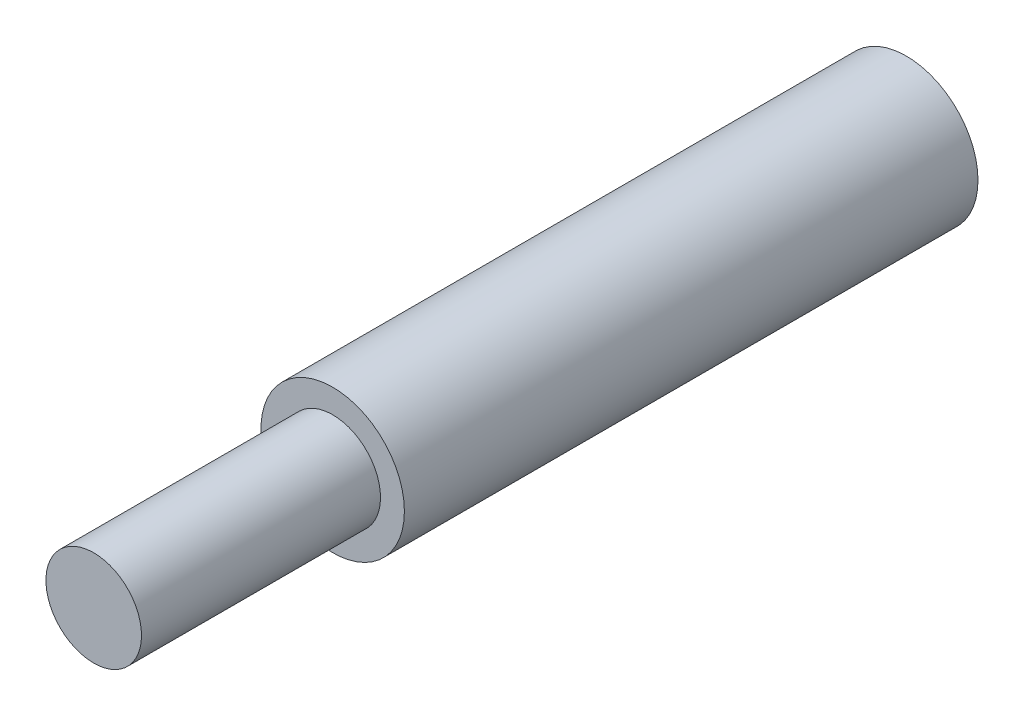
ISO-10303-21;
HEADER;
FILE_DESCRIPTION(('STEP AP214'),'2;1');
FILE_NAME('part.step','',(''),(''),'','','');
FILE_SCHEMA(('AUTOMOTIVE_DESIGN { 1 0 10303 214 1 1 1 1 }'));
ENDSEC;
DATA;
#1=APPLICATION_CONTEXT('core data for automotive mechanical design processes');
#2=APPLICATION_PROTOCOL_DEFINITION('international standard','automotive_design',2000,#1);
#3=PRODUCT_CONTEXT('',#1,'mechanical');
#4=PRODUCT('Part','Part','',(#3));
#5=PRODUCT_RELATED_PRODUCT_CATEGORY('part','',(#4));
#6=PRODUCT_DEFINITION_FORMATION('','',#4);
#7=PRODUCT_DEFINITION_CONTEXT('part definition',#1,'design');
#8=PRODUCT_DEFINITION('design','',#6,#7);
#9=PRODUCT_DEFINITION_SHAPE('','',#8);
#10=(LENGTH_UNIT() NAMED_UNIT(*) SI_UNIT(.MILLI.,.METRE.));
#11=(NAMED_UNIT(*) PLANE_ANGLE_UNIT() SI_UNIT($,.RADIAN.));
#12=(NAMED_UNIT(*) SI_UNIT($,.STERADIAN.) SOLID_ANGLE_UNIT());
#13=UNCERTAINTY_MEASURE_WITH_UNIT(LENGTH_MEASURE(1.E-05),#10,'distance_accuracy_value','');
#14=(GEOMETRIC_REPRESENTATION_CONTEXT(3) GLOBAL_UNCERTAINTY_ASSIGNED_CONTEXT((#13)) GLOBAL_UNIT_ASSIGNED_CONTEXT((#10,
#11,#12)) REPRESENTATION_CONTEXT('',''));
#15=CARTESIAN_POINT('',(0.,0.,0.));
#16=DIRECTION('',(0.,0.,1.));
#17=DIRECTION('',(1.,0.,0.));
#18=AXIS2_PLACEMENT_3D('',#15,#16,#17);
#19=CARTESIAN_POINT('',(0.,0.,0.));
#20=DIRECTION('',(0.,0.,-1.));
#21=DIRECTION('',(-1.,0.,0.));
#22=AXIS2_PLACEMENT_3D('',#19,#20,#21);
#23=CYLINDRICAL_SURFACE('',#22,3.);
#24=CARTESIAN_POINT('',(0.,0.,0.));
#25=DIRECTION('',(0.,0.,1.));
#26=DIRECTION('',(1.,0.,0.));
#27=AXIS2_PLACEMENT_3D('',#24,#25,#26);
#28=CIRCLE('',#27,3.);
#29=CARTESIAN_POINT('',(3.,0.,0.));
#30=VERTEX_POINT('',#29);
#31=EDGE_CURVE('E42',#30,#30,#28,.T.);
#32=ORIENTED_EDGE('',*,*,#31,.F.);
#33=EDGE_LOOP('',(#32));
#34=FACE_BOUND('',#33,.T.);
#35=CARTESIAN_POINT('',(0.,0.,-24.));
#36=DIRECTION('',(0.,0.,1.));
#37=DIRECTION('',(1.,0.,0.));
#38=AXIS2_PLACEMENT_3D('',#35,#36,#37);
#39=CIRCLE('',#38,3.);
#40=CARTESIAN_POINT('',(3.,0.,-24.));
#41=VERTEX_POINT('',#40);
#42=EDGE_CURVE('E37',#41,#41,#39,.T.);
#43=ORIENTED_EDGE('',*,*,#42,.T.);
#44=EDGE_LOOP('',(#43));
#45=FACE_BOUND('',#44,.T.);
#46=ADVANCED_FACE('F40',(#34,#45),#23,.T.);
#47=CARTESIAN_POINT('',(0.,0.,0.));
#48=DIRECTION('',(0.,0.,1.));
#49=DIRECTION('',(1.,0.,0.));
#50=AXIS2_PLACEMENT_3D('',#47,#48,#49);
#51=PLANE('',#50);
#52=CARTESIAN_POINT('',(0.,0.,0.));
#53=DIRECTION('',(0.,0.,1.));
#54=DIRECTION('',(1.,0.,0.));
#55=AXIS2_PLACEMENT_3D('',#52,#53,#54);
#56=CIRCLE('',#55,2.);
#57=CARTESIAN_POINT('',(2.,0.,0.));
#58=VERTEX_POINT('',#57);
#59=EDGE_CURVE('E10',#58,#58,#56,.T.);
#60=ORIENTED_EDGE('',*,*,#59,.F.);
#61=EDGE_LOOP('',(#60));
#62=FACE_BOUND('',#61,.T.);
#63=ORIENTED_EDGE('',*,*,#31,.T.);
#64=EDGE_LOOP('',(#63));
#65=FACE_BOUND('',#64,.T.);
#66=ADVANCED_FACE('F62',(#62,#65),#51,.T.);
#67=CARTESIAN_POINT('',(0.,0.,-24.));
#68=DIRECTION('',(0.,0.,1.));
#69=DIRECTION('',(1.,0.,0.));
#70=AXIS2_PLACEMENT_3D('',#67,#68,#69);
#71=PLANE('',#70);
#72=ORIENTED_EDGE('',*,*,#42,.F.);
#73=EDGE_LOOP('',(#72));
#74=FACE_BOUND('',#73,.T.);
#75=ADVANCED_FACE('F59',(#74),#71,.F.);
#76=CARTESIAN_POINT('',(0.,0.,10.));
#77=DIRECTION('',(0.,0.,-1.));
#78=DIRECTION('',(-1.,0.,0.));
#79=AXIS2_PLACEMENT_3D('',#76,#77,#78);
#80=CYLINDRICAL_SURFACE('',#79,2.);
#81=CARTESIAN_POINT('',(0.,0.,10.));
#82=DIRECTION('',(0.,0.,1.));
#83=DIRECTION('',(1.,0.,0.));
#84=AXIS2_PLACEMENT_3D('',#81,#82,#83);
#85=CIRCLE('',#84,2.);
#86=CARTESIAN_POINT('',(2.,0.,10.));
#87=VERTEX_POINT('',#86);
#88=EDGE_CURVE('E49',#87,#87,#85,.T.);
#89=ORIENTED_EDGE('',*,*,#88,.F.);
#90=EDGE_LOOP('',(#89));
#91=FACE_BOUND('',#90,.T.);
#92=ORIENTED_EDGE('',*,*,#59,.T.);
#93=EDGE_LOOP('',(#92));
#94=FACE_BOUND('',#93,.T.);
#95=ADVANCED_FACE('F58',(#91,#94),#80,.T.);
#96=CARTESIAN_POINT('',(0.,0.,10.));
#97=DIRECTION('',(0.,0.,1.));
#98=DIRECTION('',(1.,0.,0.));
#99=AXIS2_PLACEMENT_3D('',#96,#97,#98);
#100=PLANE('',#99);
#101=ORIENTED_EDGE('',*,*,#88,.T.);
#102=EDGE_LOOP('',(#101));
#103=FACE_BOUND('',#102,.T.);
#104=ADVANCED_FACE('F69',(#103),#100,.T.);
#105=CLOSED_SHELL('',(#46,#66,#75,#95,#104));
#106=MANIFOLD_SOLID_BREP('B2',#105);
#107=ADVANCED_BREP_SHAPE_REPRESENTATION('',(#18,#106),#14);
#108=SHAPE_DEFINITION_REPRESENTATION(#9,#107);
ENDSEC;
END-ISO-10303-21;
